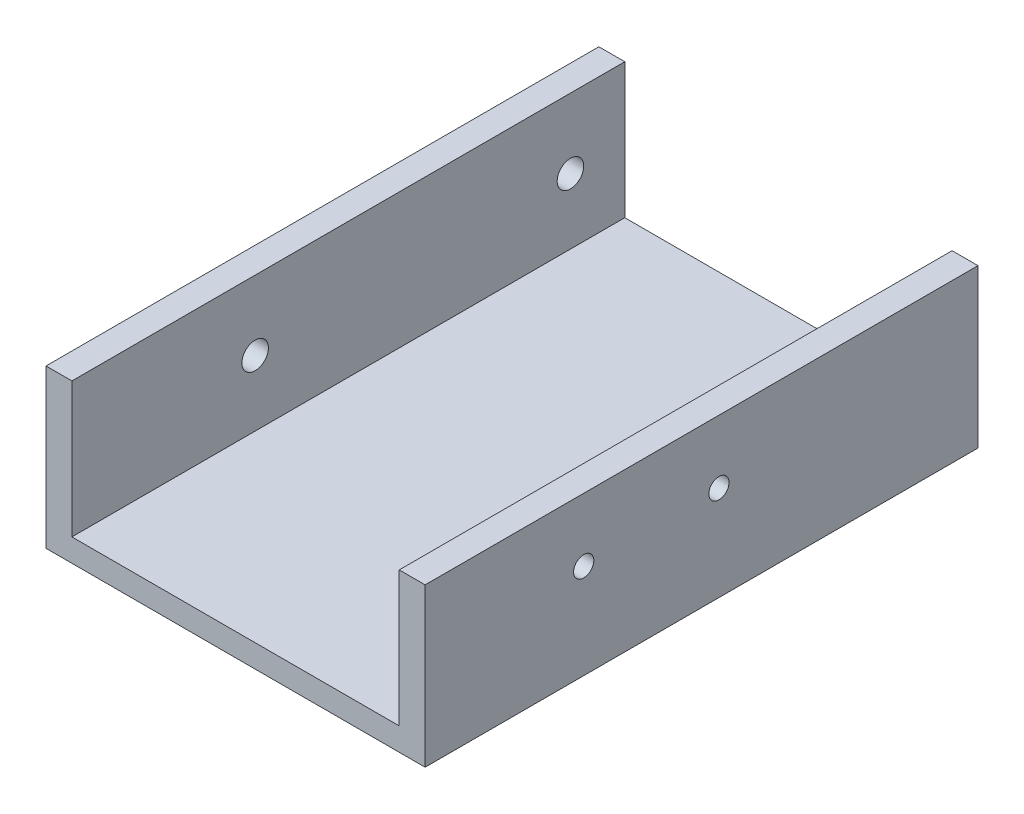
ISO-10303-21;
HEADER;
FILE_DESCRIPTION(('STEP AP214'),'2;1');
FILE_NAME('part.step','',(''),(''),'','','');
FILE_SCHEMA(('AUTOMOTIVE_DESIGN { 1 0 10303 214 1 1 1 1 }'));
ENDSEC;
DATA;
#1=APPLICATION_CONTEXT('core data for automotive mechanical design processes');
#2=APPLICATION_PROTOCOL_DEFINITION('international standard','automotive_design',2000,#1);
#3=PRODUCT_CONTEXT('',#1,'mechanical');
#4=PRODUCT('Part','Part','',(#3));
#5=PRODUCT_RELATED_PRODUCT_CATEGORY('part','',(#4));
#6=PRODUCT_DEFINITION_FORMATION('','',#4);
#7=PRODUCT_DEFINITION_CONTEXT('part definition',#1,'design');
#8=PRODUCT_DEFINITION('design','',#6,#7);
#9=PRODUCT_DEFINITION_SHAPE('','',#8);
#10=(LENGTH_UNIT() NAMED_UNIT(*) SI_UNIT(.MILLI.,.METRE.));
#11=(NAMED_UNIT(*) PLANE_ANGLE_UNIT() SI_UNIT($,.RADIAN.));
#12=(NAMED_UNIT(*) SI_UNIT($,.STERADIAN.) SOLID_ANGLE_UNIT());
#13=UNCERTAINTY_MEASURE_WITH_UNIT(LENGTH_MEASURE(1.E-05),#10,'distance_accuracy_value','');
#14=(GEOMETRIC_REPRESENTATION_CONTEXT(3) GLOBAL_UNCERTAINTY_ASSIGNED_CONTEXT((#13)) GLOBAL_UNIT_ASSIGNED_CONTEXT((#10,
#11,#12)) REPRESENTATION_CONTEXT('',''));
#15=CARTESIAN_POINT('',(0.,0.,0.));
#16=DIRECTION('',(0.,0.,1.));
#17=DIRECTION('',(1.,0.,0.));
#18=AXIS2_PLACEMENT_3D('',#15,#16,#17);
#19=CARTESIAN_POINT('',(-38.1,0.,111.125));
#20=DIRECTION('',(1.,0.,0.));
#21=DIRECTION('',(0.,0.,-1.));
#22=AXIS2_PLACEMENT_3D('',#19,#20,#21);
#23=PLANE('',#22);
#24=CARTESIAN_POINT('',(-38.1,17.78,74.295));
#25=DIRECTION('',(1.,0.,0.));
#26=DIRECTION('',(0.,0.,-1.));
#27=AXIS2_PLACEMENT_3D('',#24,#25,#26);
#28=CIRCLE('',#27,2.667);
#29=CARTESIAN_POINT('',(-38.1,17.78,71.628));
#30=VERTEX_POINT('',#29);
#31=EDGE_CURVE('E180',#30,#30,#28,.T.);
#32=ORIENTED_EDGE('',*,*,#31,.T.);
#33=EDGE_LOOP('',(#32));
#34=FACE_BOUND('',#33,.T.);
#35=CARTESIAN_POINT('',(-38.1,17.7352117874534,10.922));
#36=DIRECTION('',(1.,0.,0.));
#37=DIRECTION('',(0.,0.,-1.));
#38=AXIS2_PLACEMENT_3D('',#35,#36,#37);
#39=CIRCLE('',#38,2.667);
#40=CARTESIAN_POINT('',(-38.1,17.7352117874534,8.255));
#41=VERTEX_POINT('',#40);
#42=EDGE_CURVE('E133',#41,#41,#39,.T.);
#43=ORIENTED_EDGE('',*,*,#42,.T.);
#44=EDGE_LOOP('',(#43));
#45=FACE_BOUND('',#44,.T.);
#46=DIRECTION('',(0.,-1.,0.));
#47=VECTOR('',#46,1.);
#48=CARTESIAN_POINT('',(-38.1,0.,0.));
#49=LINE('',#48,#47);
#50=CARTESIAN_POINT('',(-38.1,31.75,0.));
#51=VERTEX_POINT('',#50);
#52=CARTESIAN_POINT('',(-38.1,0.,0.));
#53=VERTEX_POINT('',#52);
#54=EDGE_CURVE('E129',#51,#53,#49,.T.);
#55=ORIENTED_EDGE('',*,*,#54,.T.);
#56=DIRECTION('',(0.,0.,-1.));
#57=VECTOR('',#56,1.);
#58=CARTESIAN_POINT('',(-38.1,0.,111.125));
#59=LINE('',#58,#57);
#60=CARTESIAN_POINT('',(-38.1,0.,111.125));
#61=VERTEX_POINT('',#60);
#62=EDGE_CURVE('E11',#61,#53,#59,.T.);
#63=ORIENTED_EDGE('',*,*,#62,.F.);
#64=DIRECTION('',(0.,-1.,0.));
#65=VECTOR('',#64,1.);
#66=CARTESIAN_POINT('',(-38.1,0.,111.125));
#67=LINE('',#66,#65);
#68=CARTESIAN_POINT('',(-38.1,31.75,111.125));
#69=VERTEX_POINT('',#68);
#70=EDGE_CURVE('E144',#69,#61,#67,.T.);
#71=ORIENTED_EDGE('',*,*,#70,.F.);
#72=DIRECTION('',(0.,0.,-1.));
#73=VECTOR('',#72,1.);
#74=CARTESIAN_POINT('',(-38.1,31.75,111.125));
#75=LINE('',#74,#73);
#76=EDGE_CURVE('E125',#69,#51,#75,.T.);
#77=ORIENTED_EDGE('',*,*,#76,.T.);
#78=EDGE_LOOP('',(#55,#63,#71,#77));
#79=FACE_BOUND('',#78,.T.);
#80=ADVANCED_FACE('F33',(#34,#45,#79),#23,.F.);
#81=CARTESIAN_POINT('',(-38.1,0.,111.125));
#82=DIRECTION('',(0.,1.,0.));
#83=DIRECTION('',(-1.,0.,0.));
#84=AXIS2_PLACEMENT_3D('',#81,#82,#83);
#85=PLANE('',#84);
#86=DIRECTION('',(1.,0.,0.));
#87=VECTOR('',#86,1.);
#88=CARTESIAN_POINT('',(-38.1,0.,0.));
#89=LINE('',#88,#87);
#90=CARTESIAN_POINT('',(38.1,0.,0.));
#91=VERTEX_POINT('',#90);
#92=EDGE_CURVE('E132',#53,#91,#89,.T.);
#93=ORIENTED_EDGE('',*,*,#92,.T.);
#94=DIRECTION('',(0.,0.,-1.));
#95=VECTOR('',#94,1.);
#96=CARTESIAN_POINT('',(38.1,0.,111.125));
#97=LINE('',#96,#95);
#98=CARTESIAN_POINT('',(38.1,0.,111.125));
#99=VERTEX_POINT('',#98);
#100=EDGE_CURVE('E41',#99,#91,#97,.T.);
#101=ORIENTED_EDGE('',*,*,#100,.F.);
#102=DIRECTION('',(1.,0.,0.));
#103=VECTOR('',#102,1.);
#104=CARTESIAN_POINT('',(-38.1,0.,111.125));
#105=LINE('',#104,#103);
#106=EDGE_CURVE('E92',#61,#99,#105,.T.);
#107=ORIENTED_EDGE('',*,*,#106,.F.);
#108=ORIENTED_EDGE('',*,*,#62,.T.);
#109=EDGE_LOOP('',(#93,#101,#107,#108));
#110=FACE_BOUND('',#109,.T.);
#111=ADVANCED_FACE('F227',(#110),#85,.F.);
#112=CARTESIAN_POINT('',(38.1,31.75,111.125));
#113=DIRECTION('',(-1.,0.,0.));
#114=DIRECTION('',(0.,-1.,0.));
#115=AXIS2_PLACEMENT_3D('',#112,#113,#114);
#116=PLANE('',#115);
#117=CARTESIAN_POINT('',(38.1,19.05,79.248));
#118=DIRECTION('',(-1.,0.,0.));
#119=DIRECTION('',(0.,0.,1.));
#120=AXIS2_PLACEMENT_3D('',#117,#118,#119);
#121=CIRCLE('',#120,2.03200000000001);
#122=CARTESIAN_POINT('',(38.1,19.05,81.28));
#123=VERTEX_POINT('',#122);
#124=EDGE_CURVE('E192',#123,#123,#121,.T.);
#125=ORIENTED_EDGE('',*,*,#124,.T.);
#126=EDGE_LOOP('',(#125));
#127=FACE_BOUND('',#126,.T.);
#128=CARTESIAN_POINT('',(38.1,19.05,52.07));
#129=DIRECTION('',(-1.,0.,0.));
#130=DIRECTION('',(0.,0.,1.));
#131=AXIS2_PLACEMENT_3D('',#128,#129,#130);
#132=CIRCLE('',#131,2.032);
#133=CARTESIAN_POINT('',(38.1,19.05,54.102));
#134=VERTEX_POINT('',#133);
#135=EDGE_CURVE('E186',#134,#134,#132,.T.);
#136=ORIENTED_EDGE('',*,*,#135,.T.);
#137=EDGE_LOOP('',(#136));
#138=FACE_BOUND('',#137,.T.);
#139=DIRECTION('',(0.,1.,0.));
#140=VECTOR('',#139,1.);
#141=CARTESIAN_POINT('',(38.1,31.75,0.));
#142=LINE('',#141,#140);
#143=CARTESIAN_POINT('',(38.1,31.75,0.));
#144=VERTEX_POINT('',#143);
#145=EDGE_CURVE('E135',#91,#144,#142,.T.);
#146=ORIENTED_EDGE('',*,*,#145,.T.);
#147=DIRECTION('',(0.,0.,-1.));
#148=VECTOR('',#147,1.);
#149=CARTESIAN_POINT('',(38.1,31.75,111.125));
#150=LINE('',#149,#148);
#151=CARTESIAN_POINT('',(38.1,31.75,111.125));
#152=VERTEX_POINT('',#151);
#153=EDGE_CURVE('E151',#152,#144,#150,.T.);
#154=ORIENTED_EDGE('',*,*,#153,.F.);
#155=DIRECTION('',(0.,1.,0.));
#156=VECTOR('',#155,1.);
#157=CARTESIAN_POINT('',(38.1,31.75,111.125));
#158=LINE('',#157,#156);
#159=EDGE_CURVE('E159',#99,#152,#158,.T.);
#160=ORIENTED_EDGE('',*,*,#159,.F.);
#161=ORIENTED_EDGE('',*,*,#100,.T.);
#162=EDGE_LOOP('',(#146,#154,#160,#161));
#163=FACE_BOUND('',#162,.T.);
#164=ADVANCED_FACE('F157',(#127,#138,#163),#116,.F.);
#165=CARTESIAN_POINT('',(32.893,31.75,111.125));
#166=DIRECTION('',(0.,-1.,0.));
#167=DIRECTION('',(0.,0.,-1.));
#168=AXIS2_PLACEMENT_3D('',#165,#166,#167);
#169=PLANE('',#168);
#170=DIRECTION('',(-1.,0.,0.));
#171=VECTOR('',#170,1.);
#172=CARTESIAN_POINT('',(32.893,31.75,0.));
#173=LINE('',#172,#171);
#174=CARTESIAN_POINT('',(32.893,31.75,0.));
#175=VERTEX_POINT('',#174);
#176=EDGE_CURVE('E137',#144,#175,#173,.T.);
#177=ORIENTED_EDGE('',*,*,#176,.T.);
#178=DIRECTION('',(0.,0.,-1.));
#179=VECTOR('',#178,1.);
#180=CARTESIAN_POINT('',(32.893,31.75,111.125));
#181=LINE('',#180,#179);
#182=CARTESIAN_POINT('',(32.893,31.75,111.125));
#183=VERTEX_POINT('',#182);
#184=EDGE_CURVE('E148',#183,#175,#181,.T.);
#185=ORIENTED_EDGE('',*,*,#184,.F.);
#186=DIRECTION('',(-1.,0.,0.));
#187=VECTOR('',#186,1.);
#188=CARTESIAN_POINT('',(32.893,31.75,111.125));
#189=LINE('',#188,#187);
#190=EDGE_CURVE('E171',#152,#183,#189,.T.);
#191=ORIENTED_EDGE('',*,*,#190,.F.);
#192=ORIENTED_EDGE('',*,*,#153,.T.);
#193=EDGE_LOOP('',(#177,#185,#191,#192));
#194=FACE_BOUND('',#193,.T.);
#195=ADVANCED_FACE('F167',(#194),#169,.F.);
#196=CARTESIAN_POINT('',(32.893,4.5974,111.125));
#197=DIRECTION('',(1.,0.,0.));
#198=DIRECTION('',(0.,0.,-1.));
#199=AXIS2_PLACEMENT_3D('',#196,#197,#198);
#200=PLANE('',#199);
#201=CARTESIAN_POINT('',(32.893,19.05,79.248));
#202=DIRECTION('',(-1.,0.,0.));
#203=DIRECTION('',(0.,0.,1.));
#204=AXIS2_PLACEMENT_3D('',#201,#202,#203);
#205=CIRCLE('',#204,2.03200000000001);
#206=CARTESIAN_POINT('',(32.893,19.05,81.28));
#207=VERTEX_POINT('',#206);
#208=EDGE_CURVE('E195',#207,#207,#205,.T.);
#209=ORIENTED_EDGE('',*,*,#208,.F.);
#210=EDGE_LOOP('',(#209));
#211=FACE_BOUND('',#210,.T.);
#212=CARTESIAN_POINT('',(32.893,19.05,52.07));
#213=DIRECTION('',(-1.,0.,0.));
#214=DIRECTION('',(0.,0.,1.));
#215=AXIS2_PLACEMENT_3D('',#212,#213,#214);
#216=CIRCLE('',#215,2.032);
#217=CARTESIAN_POINT('',(32.893,19.05,54.102));
#218=VERTEX_POINT('',#217);
#219=EDGE_CURVE('E189',#218,#218,#216,.T.);
#220=ORIENTED_EDGE('',*,*,#219,.F.);
#221=EDGE_LOOP('',(#220));
#222=FACE_BOUND('',#221,.T.);
#223=DIRECTION('',(0.,-1.,0.));
#224=VECTOR('',#223,1.);
#225=CARTESIAN_POINT('',(32.893,4.5974,0.));
#226=LINE('',#225,#224);
#227=CARTESIAN_POINT('',(32.893,4.5974,0.));
#228=VERTEX_POINT('',#227);
#229=EDGE_CURVE('E139',#175,#228,#226,.T.);
#230=ORIENTED_EDGE('',*,*,#229,.T.);
#231=DIRECTION('',(0.,0.,-1.));
#232=VECTOR('',#231,1.);
#233=CARTESIAN_POINT('',(32.893,4.5974,111.125));
#234=LINE('',#233,#232);
#235=CARTESIAN_POINT('',(32.893,4.5974,111.125));
#236=VERTEX_POINT('',#235);
#237=EDGE_CURVE('E120',#236,#228,#234,.T.);
#238=ORIENTED_EDGE('',*,*,#237,.F.);
#239=DIRECTION('',(0.,-1.,0.));
#240=VECTOR('',#239,1.);
#241=CARTESIAN_POINT('',(32.893,4.5974,111.125));
#242=LINE('',#241,#240);
#243=EDGE_CURVE('E111',#183,#236,#242,.T.);
#244=ORIENTED_EDGE('',*,*,#243,.F.);
#245=ORIENTED_EDGE('',*,*,#184,.T.);
#246=EDGE_LOOP('',(#230,#238,#244,#245));
#247=FACE_BOUND('',#246,.T.);
#248=ADVANCED_FACE('F170',(#211,#222,#247),#200,.F.);
#249=CARTESIAN_POINT('',(-32.893,4.5974,111.125));
#250=DIRECTION('',(0.,-1.,0.));
#251=DIRECTION('',(0.,0.,-1.));
#252=AXIS2_PLACEMENT_3D('',#249,#250,#251);
#253=PLANE('',#252);
#254=DIRECTION('',(-1.,0.,0.));
#255=VECTOR('',#254,1.);
#256=CARTESIAN_POINT('',(-32.893,4.5974,0.));
#257=LINE('',#256,#255);
#258=CARTESIAN_POINT('',(-32.893,4.5974,0.));
#259=VERTEX_POINT('',#258);
#260=EDGE_CURVE('E119',#228,#259,#257,.T.);
#261=ORIENTED_EDGE('',*,*,#260,.T.);
#262=DIRECTION('',(0.,0.,-1.));
#263=VECTOR('',#262,1.);
#264=CARTESIAN_POINT('',(-32.893,4.5974,111.125));
#265=LINE('',#264,#263);
#266=CARTESIAN_POINT('',(-32.893,4.5974,111.125));
#267=VERTEX_POINT('',#266);
#268=EDGE_CURVE('E116',#267,#259,#265,.T.);
#269=ORIENTED_EDGE('',*,*,#268,.F.);
#270=DIRECTION('',(-1.,0.,0.));
#271=VECTOR('',#270,1.);
#272=CARTESIAN_POINT('',(-32.893,4.5974,111.125));
#273=LINE('',#272,#271);
#274=EDGE_CURVE('E105',#236,#267,#273,.T.);
#275=ORIENTED_EDGE('',*,*,#274,.F.);
#276=ORIENTED_EDGE('',*,*,#237,.T.);
#277=EDGE_LOOP('',(#261,#269,#275,#276));
#278=FACE_BOUND('',#277,.T.);
#279=ADVANCED_FACE('F117',(#278),#253,.F.);
#280=CARTESIAN_POINT('',(-32.893,31.75,111.125));
#281=DIRECTION('',(-1.,0.,0.));
#282=DIRECTION('',(0.,0.,1.));
#283=AXIS2_PLACEMENT_3D('',#280,#281,#282);
#284=PLANE('',#283);
#285=CARTESIAN_POINT('',(-32.893,17.78,74.295));
#286=DIRECTION('',(1.,0.,0.));
#287=DIRECTION('',(0.,0.,-1.));
#288=AXIS2_PLACEMENT_3D('',#285,#286,#287);
#289=CIRCLE('',#288,2.667);
#290=CARTESIAN_POINT('',(-32.893,17.78,71.628));
#291=VERTEX_POINT('',#290);
#292=EDGE_CURVE('E183',#291,#291,#289,.T.);
#293=ORIENTED_EDGE('',*,*,#292,.F.);
#294=EDGE_LOOP('',(#293));
#295=FACE_BOUND('',#294,.T.);
#296=CARTESIAN_POINT('',(-32.893,17.7352117874534,10.922));
#297=DIRECTION('',(1.,0.,0.));
#298=DIRECTION('',(0.,0.,-1.));
#299=AXIS2_PLACEMENT_3D('',#296,#297,#298);
#300=CIRCLE('',#299,2.667);
#301=CARTESIAN_POINT('',(-32.893,17.7352117874534,8.255));
#302=VERTEX_POINT('',#301);
#303=EDGE_CURVE('E177',#302,#302,#300,.T.);
#304=ORIENTED_EDGE('',*,*,#303,.F.);
#305=EDGE_LOOP('',(#304));
#306=FACE_BOUND('',#305,.T.);
#307=DIRECTION('',(0.,1.,0.));
#308=VECTOR('',#307,1.);
#309=CARTESIAN_POINT('',(-32.893,31.75,0.));
#310=LINE('',#309,#308);
#311=CARTESIAN_POINT('',(-32.893,31.75,0.));
#312=VERTEX_POINT('',#311);
#313=EDGE_CURVE('E78',#259,#312,#310,.T.);
#314=ORIENTED_EDGE('',*,*,#313,.T.);
#315=DIRECTION('',(0.,0.,-1.));
#316=VECTOR('',#315,1.);
#317=CARTESIAN_POINT('',(-32.893,31.75,111.125));
#318=LINE('',#317,#316);
#319=CARTESIAN_POINT('',(-32.893,31.75,111.125));
#320=VERTEX_POINT('',#319);
#321=EDGE_CURVE('E121',#320,#312,#318,.T.);
#322=ORIENTED_EDGE('',*,*,#321,.F.);
#323=DIRECTION('',(0.,1.,0.));
#324=VECTOR('',#323,1.);
#325=CARTESIAN_POINT('',(-32.893,31.75,111.125));
#326=LINE('',#325,#324);
#327=EDGE_CURVE('E109',#267,#320,#326,.T.);
#328=ORIENTED_EDGE('',*,*,#327,.F.);
#329=ORIENTED_EDGE('',*,*,#268,.T.);
#330=EDGE_LOOP('',(#314,#322,#328,#329));
#331=FACE_BOUND('',#330,.T.);
#332=ADVANCED_FACE('F123',(#295,#306,#331),#284,.F.);
#333=CARTESIAN_POINT('',(-38.1,31.75,111.125));
#334=DIRECTION('',(0.,-1.,0.));
#335=DIRECTION('',(0.,0.,-1.));
#336=AXIS2_PLACEMENT_3D('',#333,#334,#335);
#337=PLANE('',#336);
#338=DIRECTION('',(-1.,0.,0.));
#339=VECTOR('',#338,1.);
#340=CARTESIAN_POINT('',(-38.1,31.75,0.));
#341=LINE('',#340,#339);
#342=EDGE_CURVE('E84',#312,#51,#341,.T.);
#343=ORIENTED_EDGE('',*,*,#342,.T.);
#344=ORIENTED_EDGE('',*,*,#76,.F.);
#345=DIRECTION('',(-1.,0.,0.));
#346=VECTOR('',#345,1.);
#347=CARTESIAN_POINT('',(-38.1,31.75,111.125));
#348=LINE('',#347,#346);
#349=EDGE_CURVE('E49',#320,#69,#348,.T.);
#350=ORIENTED_EDGE('',*,*,#349,.F.);
#351=ORIENTED_EDGE('',*,*,#321,.T.);
#352=EDGE_LOOP('',(#343,#344,#350,#351));
#353=FACE_BOUND('',#352,.T.);
#354=ADVANCED_FACE('F238',(#353),#337,.F.);
#355=CARTESIAN_POINT('',(0.,0.,111.125));
#356=DIRECTION('',(0.,0.,-1.));
#357=DIRECTION('',(-1.,0.,0.));
#358=AXIS2_PLACEMENT_3D('',#355,#356,#357);
#359=PLANE('',#358);
#360=ORIENTED_EDGE('',*,*,#70,.T.);
#361=ORIENTED_EDGE('',*,*,#106,.T.);
#362=ORIENTED_EDGE('',*,*,#159,.T.);
#363=ORIENTED_EDGE('',*,*,#190,.T.);
#364=ORIENTED_EDGE('',*,*,#243,.T.);
#365=ORIENTED_EDGE('',*,*,#274,.T.);
#366=ORIENTED_EDGE('',*,*,#327,.T.);
#367=ORIENTED_EDGE('',*,*,#349,.T.);
#368=EDGE_LOOP('',(#360,#361,#362,#363,#364,#365,#366,#367));
#369=FACE_BOUND('',#368,.T.);
#370=ADVANCED_FACE('F107',(#369),#359,.F.);
#371=CARTESIAN_POINT('',(0.,0.,0.));
#372=DIRECTION('',(0.,0.,-1.));
#373=DIRECTION('',(-1.,0.,0.));
#374=AXIS2_PLACEMENT_3D('',#371,#372,#373);
#375=PLANE('',#374);
#376=ORIENTED_EDGE('',*,*,#54,.F.);
#377=ORIENTED_EDGE('',*,*,#342,.F.);
#378=ORIENTED_EDGE('',*,*,#313,.F.);
#379=ORIENTED_EDGE('',*,*,#260,.F.);
#380=ORIENTED_EDGE('',*,*,#229,.F.);
#381=ORIENTED_EDGE('',*,*,#176,.F.);
#382=ORIENTED_EDGE('',*,*,#145,.F.);
#383=ORIENTED_EDGE('',*,*,#92,.F.);
#384=EDGE_LOOP('',(#376,#377,#378,#379,#380,#381,#382,#383));
#385=FACE_BOUND('',#384,.T.);
#386=ADVANCED_FACE('F163',(#385),#375,.T.);
#387=CARTESIAN_POINT('',(-38.1,17.7352117874534,10.922));
#388=DIRECTION('',(1.,0.,0.));
#389=DIRECTION('',(0.,0.,-1.));
#390=AXIS2_PLACEMENT_3D('',#387,#388,#389);
#391=CYLINDRICAL_SURFACE('',#390,2.667);
#392=ORIENTED_EDGE('',*,*,#42,.F.);
#393=EDGE_LOOP('',(#392));
#394=FACE_BOUND('',#393,.T.);
#395=ORIENTED_EDGE('',*,*,#303,.T.);
#396=EDGE_LOOP('',(#395));
#397=FACE_BOUND('',#396,.T.);
#398=ADVANCED_FACE('F222',(#394,#397),#391,.F.);
#399=CARTESIAN_POINT('',(-38.1,17.78,74.295));
#400=DIRECTION('',(1.,0.,0.));
#401=DIRECTION('',(0.,0.,-1.));
#402=AXIS2_PLACEMENT_3D('',#399,#400,#401);
#403=CYLINDRICAL_SURFACE('',#402,2.667);
#404=ORIENTED_EDGE('',*,*,#31,.F.);
#405=EDGE_LOOP('',(#404));
#406=FACE_BOUND('',#405,.T.);
#407=ORIENTED_EDGE('',*,*,#292,.T.);
#408=EDGE_LOOP('',(#407));
#409=FACE_BOUND('',#408,.T.);
#410=ADVANCED_FACE('F216',(#406,#409),#403,.F.);
#411=CARTESIAN_POINT('',(38.1,19.05,52.07));
#412=DIRECTION('',(-1.,0.,0.));
#413=DIRECTION('',(0.,0.,1.));
#414=AXIS2_PLACEMENT_3D('',#411,#412,#413);
#415=CYLINDRICAL_SURFACE('',#414,2.032);
#416=ORIENTED_EDGE('',*,*,#135,.F.);
#417=EDGE_LOOP('',(#416));
#418=FACE_BOUND('',#417,.T.);
#419=ORIENTED_EDGE('',*,*,#219,.T.);
#420=EDGE_LOOP('',(#419));
#421=FACE_BOUND('',#420,.T.);
#422=ADVANCED_FACE('F206',(#418,#421),#415,.F.);
#423=CARTESIAN_POINT('',(38.1,19.05,79.248));
#424=DIRECTION('',(-1.,0.,0.));
#425=DIRECTION('',(0.,0.,1.));
#426=AXIS2_PLACEMENT_3D('',#423,#424,#425);
#427=CYLINDRICAL_SURFACE('',#426,2.03200000000001);
#428=ORIENTED_EDGE('',*,*,#124,.F.);
#429=EDGE_LOOP('',(#428));
#430=FACE_BOUND('',#429,.T.);
#431=ORIENTED_EDGE('',*,*,#208,.T.);
#432=EDGE_LOOP('',(#431));
#433=FACE_BOUND('',#432,.T.);
#434=ADVANCED_FACE('F203',(#430,#433),#427,.F.);
#435=CLOSED_SHELL('',(#80,#111,#164,#195,#248,#279,#332,#354,#370,#386,#398,#410,#422,#434));
#436=MANIFOLD_SOLID_BREP('B2',#435);
#437=ADVANCED_BREP_SHAPE_REPRESENTATION('',(#18,#436),#14);
#438=SHAPE_DEFINITION_REPRESENTATION(#9,#437);
ENDSEC;
END-ISO-10303-21;
